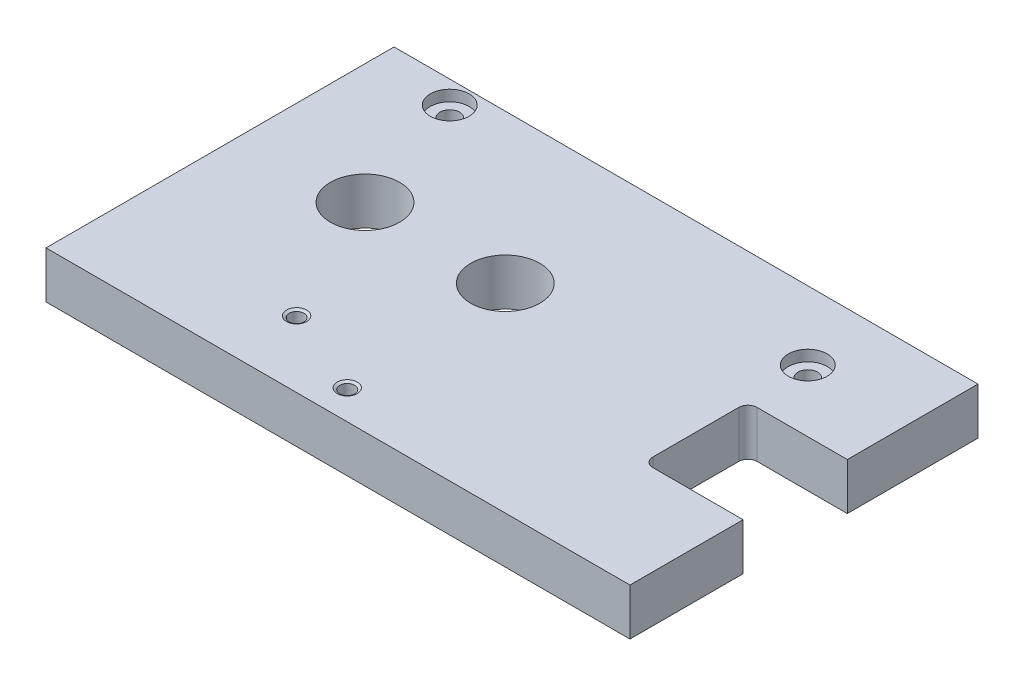
ISO-10303-21;
HEADER;
FILE_DESCRIPTION(('STEP AP214'),'2;1');
FILE_NAME('part.step','',(''),(''),'','','');
FILE_SCHEMA(('AUTOMOTIVE_DESIGN { 1 0 10303 214 1 1 1 1 }'));
ENDSEC;
DATA;
#1=APPLICATION_CONTEXT('core data for automotive mechanical design processes');
#2=APPLICATION_PROTOCOL_DEFINITION('international standard','automotive_design',2000,#1);
#3=PRODUCT_CONTEXT('',#1,'mechanical');
#4=PRODUCT('Part','Part','',(#3));
#5=PRODUCT_RELATED_PRODUCT_CATEGORY('part','',(#4));
#6=PRODUCT_DEFINITION_FORMATION('','',#4);
#7=PRODUCT_DEFINITION_CONTEXT('part definition',#1,'design');
#8=PRODUCT_DEFINITION('design','',#6,#7);
#9=PRODUCT_DEFINITION_SHAPE('','',#8);
#10=(LENGTH_UNIT() NAMED_UNIT(*) SI_UNIT(.MILLI.,.METRE.));
#11=(NAMED_UNIT(*) PLANE_ANGLE_UNIT() SI_UNIT($,.RADIAN.));
#12=(NAMED_UNIT(*) SI_UNIT($,.STERADIAN.) SOLID_ANGLE_UNIT());
#13=UNCERTAINTY_MEASURE_WITH_UNIT(LENGTH_MEASURE(1.E-05),#10,'distance_accuracy_value','');
#14=(GEOMETRIC_REPRESENTATION_CONTEXT(3) GLOBAL_UNCERTAINTY_ASSIGNED_CONTEXT((#13)) GLOBAL_UNIT_ASSIGNED_CONTEXT((#10,
#11,#12)) REPRESENTATION_CONTEXT('',''));
#15=CARTESIAN_POINT('',(0.,0.,0.));
#16=DIRECTION('',(0.,0.,1.));
#17=DIRECTION('',(1.,0.,0.));
#18=AXIS2_PLACEMENT_3D('',#15,#16,#17);
#19=CARTESIAN_POINT('',(21.425,12.83,6.17));
#20=DIRECTION('',(0.,1.,0.));
#21=DIRECTION('',(0.,0.,1.));
#22=AXIS2_PLACEMENT_3D('',#19,#20,#21);
#23=CYLINDRICAL_SURFACE('',#22,2.67500000000001);
#24=CARTESIAN_POINT('',(21.425,9.83,6.17));
#25=DIRECTION('',(0.,1.,0.));
#26=DIRECTION('',(0.,0.,1.));
#27=AXIS2_PLACEMENT_3D('',#24,#25,#26);
#28=CIRCLE('',#27,2.67500000000001);
#29=CARTESIAN_POINT('',(21.425,9.83,8.84500000000001));
#30=VERTEX_POINT('',#29);
#31=EDGE_CURVE('E206',#30,#30,#28,.T.);
#32=ORIENTED_EDGE('',*,*,#31,.T.);
#33=EDGE_LOOP('',(#32));
#34=FACE_BOUND('',#33,.T.);
#35=CARTESIAN_POINT('',(21.425,3.175,6.17));
#36=DIRECTION('',(0.,-1.,0.));
#37=DIRECTION('',(0.,0.,-1.));
#38=AXIS2_PLACEMENT_3D('',#35,#36,#37);
#39=CIRCLE('',#38,2.67500000000001);
#40=CARTESIAN_POINT('',(21.425,3.175,3.49499999999999));
#41=VERTEX_POINT('',#40);
#42=EDGE_CURVE('E36',#41,#41,#39,.F.);
#43=ORIENTED_EDGE('',*,*,#42,.F.);
#44=EDGE_LOOP('',(#43));
#45=FACE_BOUND('',#44,.T.);
#46=ADVANCED_FACE('F32',(#34,#45),#23,.F.);
#47=CARTESIAN_POINT('',(132.175,12.83,18.815));
#48=DIRECTION('',(0.,1.,0.));
#49=DIRECTION('',(0.,0.,1.));
#50=AXIS2_PLACEMENT_3D('',#47,#48,#49);
#51=CYLINDRICAL_SURFACE('',#50,2.67500000000001);
#52=CARTESIAN_POINT('',(132.175,9.83,18.815));
#53=DIRECTION('',(0.,1.,0.));
#54=DIRECTION('',(0.,0.,1.));
#55=AXIS2_PLACEMENT_3D('',#52,#53,#54);
#56=CIRCLE('',#55,2.67500000000001);
#57=CARTESIAN_POINT('',(132.175,9.83,21.49));
#58=VERTEX_POINT('',#57);
#59=EDGE_CURVE('E215',#58,#58,#56,.T.);
#60=ORIENTED_EDGE('',*,*,#59,.T.);
#61=EDGE_LOOP('',(#60));
#62=FACE_BOUND('',#61,.T.);
#63=CARTESIAN_POINT('',(132.175,3.301941,18.815));
#64=DIRECTION('',(0.,-1.,0.));
#65=DIRECTION('',(0.,0.,-1.));
#66=AXIS2_PLACEMENT_3D('',#63,#64,#65);
#67=CIRCLE('',#66,2.67500000000001);
#68=CARTESIAN_POINT('',(132.175,3.301941,16.14));
#69=VERTEX_POINT('',#68);
#70=EDGE_CURVE('E166',#69,#69,#67,.F.);
#71=ORIENTED_EDGE('',*,*,#70,.F.);
#72=EDGE_LOOP('',(#71));
#73=FACE_BOUND('',#72,.T.);
#74=ADVANCED_FACE('F277',(#62,#73),#51,.F.);
#75=CARTESIAN_POINT('',(160.,12.83,0.));
#76=DIRECTION('',(-1.,0.,0.));
#77=DIRECTION('',(0.,0.,1.));
#78=AXIS2_PLACEMENT_3D('',#75,#76,#77);
#79=PLANE('',#78);
#80=DIRECTION('',(0.,0.,-1.));
#81=VECTOR('',#80,1.);
#82=CARTESIAN_POINT('',(160.,0.,0.));
#83=LINE('',#82,#81);
#84=CARTESIAN_POINT('',(160.,0.,95.37));
#85=VERTEX_POINT('',#84);
#86=CARTESIAN_POINT('',(160.,0.,64.37));
#87=VERTEX_POINT('',#86);
#88=EDGE_CURVE('E131',#85,#87,#83,.T.);
#89=ORIENTED_EDGE('',*,*,#88,.T.);
#90=DIRECTION('',(0.,1.,0.));
#91=VECTOR('',#90,1.);
#92=CARTESIAN_POINT('',(160.,0.,64.37));
#93=LINE('',#92,#91);
#94=CARTESIAN_POINT('',(160.,12.83,64.37));
#95=VERTEX_POINT('',#94);
#96=EDGE_CURVE('E124',#87,#95,#93,.T.);
#97=ORIENTED_EDGE('',*,*,#96,.T.);
#98=DIRECTION('',(0.,0.,-1.));
#99=VECTOR('',#98,1.);
#100=CARTESIAN_POINT('',(160.,12.83,0.));
#101=LINE('',#100,#99);
#102=CARTESIAN_POINT('',(160.,12.83,95.37));
#103=VERTEX_POINT('',#102);
#104=EDGE_CURVE('E245',#103,#95,#101,.T.);
#105=ORIENTED_EDGE('',*,*,#104,.F.);
#106=DIRECTION('',(0.,-1.,0.));
#107=VECTOR('',#106,1.);
#108=CARTESIAN_POINT('',(160.,12.83,95.37));
#109=LINE('',#108,#107);
#110=EDGE_CURVE('E147',#103,#85,#109,.T.);
#111=ORIENTED_EDGE('',*,*,#110,.T.);
#112=EDGE_LOOP('',(#89,#97,#105,#111));
#113=FACE_BOUND('',#112,.T.);
#114=ADVANCED_FACE('F274',(#113),#79,.F.);
#115=CARTESIAN_POINT('',(0.,12.83,0.));
#116=DIRECTION('',(1.,0.,0.));
#117=DIRECTION('',(0.,0.,-1.));
#118=AXIS2_PLACEMENT_3D('',#115,#116,#117);
#119=PLANE('',#118);
#120=DIRECTION('',(0.,0.,1.));
#121=VECTOR('',#120,1.);
#122=CARTESIAN_POINT('',(0.,0.,0.));
#123=LINE('',#122,#121);
#124=CARTESIAN_POINT('',(0.,0.,0.));
#125=VERTEX_POINT('',#124);
#126=CARTESIAN_POINT('',(0.,0.,95.37));
#127=VERTEX_POINT('',#126);
#128=EDGE_CURVE('E135',#125,#127,#123,.T.);
#129=ORIENTED_EDGE('',*,*,#128,.T.);
#130=DIRECTION('',(0.,-1.,0.));
#131=VECTOR('',#130,1.);
#132=CARTESIAN_POINT('',(0.,12.83,95.37));
#133=LINE('',#132,#131);
#134=CARTESIAN_POINT('',(0.,12.83,95.37));
#135=VERTEX_POINT('',#134);
#136=EDGE_CURVE('E150',#135,#127,#133,.T.);
#137=ORIENTED_EDGE('',*,*,#136,.F.);
#138=DIRECTION('',(0.,0.,1.));
#139=VECTOR('',#138,1.);
#140=CARTESIAN_POINT('',(0.,12.83,0.));
#141=LINE('',#140,#139);
#142=CARTESIAN_POINT('',(0.,12.83,0.));
#143=VERTEX_POINT('',#142);
#144=EDGE_CURVE('E140',#143,#135,#141,.T.);
#145=ORIENTED_EDGE('',*,*,#144,.F.);
#146=DIRECTION('',(0.,-1.,0.));
#147=VECTOR('',#146,1.);
#148=CARTESIAN_POINT('',(0.,12.83,0.));
#149=LINE('',#148,#147);
#150=EDGE_CURVE('E141',#143,#125,#149,.T.);
#151=ORIENTED_EDGE('',*,*,#150,.T.);
#152=EDGE_LOOP('',(#129,#137,#145,#151));
#153=FACE_BOUND('',#152,.T.);
#154=ADVANCED_FACE('F251',(#153),#119,.F.);
#155=CARTESIAN_POINT('',(0.,12.83,95.37));
#156=DIRECTION('',(0.,0.,-1.));
#157=DIRECTION('',(-1.,0.,0.));
#158=AXIS2_PLACEMENT_3D('',#155,#156,#157);
#159=PLANE('',#158);
#160=DIRECTION('',(1.,0.,0.));
#161=VECTOR('',#160,1.);
#162=CARTESIAN_POINT('',(0.,0.,95.37));
#163=LINE('',#162,#161);
#164=EDGE_CURVE('E132',#127,#85,#163,.T.);
#165=ORIENTED_EDGE('',*,*,#164,.T.);
#166=ORIENTED_EDGE('',*,*,#110,.F.);
#167=DIRECTION('',(1.,0.,0.));
#168=VECTOR('',#167,1.);
#169=CARTESIAN_POINT('',(0.,12.83,95.37));
#170=LINE('',#169,#168);
#171=EDGE_CURVE('E243',#135,#103,#170,.T.);
#172=ORIENTED_EDGE('',*,*,#171,.F.);
#173=ORIENTED_EDGE('',*,*,#136,.T.);
#174=EDGE_LOOP('',(#165,#166,#172,#173));
#175=FACE_BOUND('',#174,.T.);
#176=ADVANCED_FACE('F257',(#175),#159,.F.);
#177=CARTESIAN_POINT('',(160.,12.83,35.81));
#178=VERTEX_POINT('',#177);
#179=CARTESIAN_POINT('',(160.,12.83,0.));
#180=VERTEX_POINT('',#179);
#181=EDGE_CURVE('E123',#178,#180,#101,.T.);
#182=ORIENTED_EDGE('',*,*,#181,.F.);
#183=DIRECTION('',(0.,1.,0.));
#184=VECTOR('',#183,1.);
#185=CARTESIAN_POINT('',(160.,0.,35.81));
#186=LINE('',#185,#184);
#187=CARTESIAN_POINT('',(160.,0.,35.81));
#188=VERTEX_POINT('',#187);
#189=EDGE_CURVE('E110',#188,#178,#186,.T.);
#190=ORIENTED_EDGE('',*,*,#189,.F.);
#191=CARTESIAN_POINT('',(160.,0.,0.));
#192=VERTEX_POINT('',#191);
#193=EDGE_CURVE('E121',#188,#192,#83,.T.);
#194=ORIENTED_EDGE('',*,*,#193,.T.);
#195=DIRECTION('',(0.,-1.,0.));
#196=VECTOR('',#195,1.);
#197=CARTESIAN_POINT('',(160.,12.83,0.));
#198=LINE('',#197,#196);
#199=EDGE_CURVE('E144',#180,#192,#198,.T.);
#200=ORIENTED_EDGE('',*,*,#199,.F.);
#201=EDGE_LOOP('',(#182,#190,#194,#200));
#202=FACE_BOUND('',#201,.T.);
#203=ADVANCED_FACE('F119',(#202),#79,.F.);
#204=CARTESIAN_POINT('',(0.,12.83,0.));
#205=DIRECTION('',(0.,0.,1.));
#206=DIRECTION('',(1.,0.,0.));
#207=AXIS2_PLACEMENT_3D('',#204,#205,#206);
#208=PLANE('',#207);
#209=DIRECTION('',(-1.,0.,0.));
#210=VECTOR('',#209,1.);
#211=CARTESIAN_POINT('',(0.,0.,0.));
#212=LINE('',#211,#210);
#213=EDGE_CURVE('E130',#192,#125,#212,.T.);
#214=ORIENTED_EDGE('',*,*,#213,.T.);
#215=ORIENTED_EDGE('',*,*,#150,.F.);
#216=DIRECTION('',(-1.,0.,0.));
#217=VECTOR('',#216,1.);
#218=CARTESIAN_POINT('',(0.,12.83,0.));
#219=LINE('',#218,#217);
#220=EDGE_CURVE('E145',#180,#143,#219,.T.);
#221=ORIENTED_EDGE('',*,*,#220,.F.);
#222=ORIENTED_EDGE('',*,*,#199,.T.);
#223=EDGE_LOOP('',(#214,#215,#221,#222));
#224=FACE_BOUND('',#223,.T.);
#225=ADVANCED_FACE('F264',(#224),#208,.F.);
#226=CARTESIAN_POINT('',(0.,12.83,95.37));
#227=DIRECTION('',(0.,1.,0.));
#228=DIRECTION('',(0.,0.,1.));
#229=AXIS2_PLACEMENT_3D('',#226,#227,#228);
#230=PLANE('',#229);
#231=CARTESIAN_POINT('',(50.46,12.83,77.16));
#232=DIRECTION('',(0.,1.,0.));
#233=DIRECTION('',(0.,0.,1.));
#234=AXIS2_PLACEMENT_3D('',#231,#232,#233);
#235=CIRCLE('',#234,2.75);
#236=CARTESIAN_POINT('',(50.46,12.83,79.91));
#237=VERTEX_POINT('',#236);
#238=EDGE_CURVE('E168',#237,#237,#235,.T.);
#239=ORIENTED_EDGE('',*,*,#238,.F.);
#240=EDGE_LOOP('',(#239));
#241=FACE_BOUND('',#240,.T.);
#242=CARTESIAN_POINT('',(74.48,12.83,87.31));
#243=DIRECTION('',(0.,1.,0.));
#244=DIRECTION('',(0.,0.,1.));
#245=AXIS2_PLACEMENT_3D('',#242,#243,#244);
#246=CIRCLE('',#245,2.75);
#247=CARTESIAN_POINT('',(74.48,12.83,90.06));
#248=VERTEX_POINT('',#247);
#249=EDGE_CURVE('E191',#248,#248,#246,.T.);
#250=ORIENTED_EDGE('',*,*,#249,.F.);
#251=EDGE_LOOP('',(#250));
#252=FACE_BOUND('',#251,.T.);
#253=CARTESIAN_POINT('',(21.425,12.83,6.17));
#254=DIRECTION('',(0.,1.,0.));
#255=DIRECTION('',(0.,0.,1.));
#256=AXIS2_PLACEMENT_3D('',#253,#254,#255);
#257=CIRCLE('',#256,5.32500000000001);
#258=CARTESIAN_POINT('',(21.425,12.83,11.495));
#259=VERTEX_POINT('',#258);
#260=EDGE_CURVE('E200',#259,#259,#257,.T.);
#261=ORIENTED_EDGE('',*,*,#260,.F.);
#262=EDGE_LOOP('',(#261));
#263=FACE_BOUND('',#262,.T.);
#264=CARTESIAN_POINT('',(132.175,12.83,18.815));
#265=DIRECTION('',(0.,1.,0.));
#266=DIRECTION('',(0.,0.,1.));
#267=AXIS2_PLACEMENT_3D('',#264,#265,#266);
#268=CIRCLE('',#267,5.32500000000002);
#269=CARTESIAN_POINT('',(132.175,12.83,24.14));
#270=VERTEX_POINT('',#269);
#271=EDGE_CURVE('E209',#270,#270,#268,.T.);
#272=ORIENTED_EDGE('',*,*,#271,.F.);
#273=EDGE_LOOP('',(#272));
#274=FACE_BOUND('',#273,.T.);
#275=DIRECTION('',(1.,0.,0.));
#276=VECTOR('',#275,1.);
#277=CARTESIAN_POINT('',(160.,12.83,64.37));
#278=LINE('',#277,#276);
#279=CARTESIAN_POINT('',(135.26,12.83,64.37));
#280=VERTEX_POINT('',#279);
#281=EDGE_CURVE('E115',#280,#95,#278,.T.);
#282=ORIENTED_EDGE('',*,*,#281,.F.);
#283=CARTESIAN_POINT('',(135.26,12.83,61.87));
#284=DIRECTION('',(0.,1.,0.));
#285=DIRECTION('',(0.,0.,1.));
#286=AXIS2_PLACEMENT_3D('',#283,#284,#285);
#287=CIRCLE('',#286,2.5);
#288=CARTESIAN_POINT('',(132.76,12.83,61.87));
#289=VERTEX_POINT('',#288);
#290=EDGE_CURVE('E162',#280,#289,#287,.F.);
#291=ORIENTED_EDGE('',*,*,#290,.T.);
#292=DIRECTION('',(0.,0.,1.));
#293=VECTOR('',#292,1.);
#294=CARTESIAN_POINT('',(132.76,12.83,64.37));
#295=LINE('',#294,#293);
#296=CARTESIAN_POINT('',(132.76,12.83,38.31));
#297=VERTEX_POINT('',#296);
#298=EDGE_CURVE('E223',#297,#289,#295,.T.);
#299=ORIENTED_EDGE('',*,*,#298,.F.);
#300=CARTESIAN_POINT('',(135.26,12.83,38.31));
#301=DIRECTION('',(0.,1.,0.));
#302=DIRECTION('',(0.,0.,1.));
#303=AXIS2_PLACEMENT_3D('',#300,#301,#302);
#304=CIRCLE('',#303,2.5);
#305=CARTESIAN_POINT('',(135.26,12.83,35.81));
#306=VERTEX_POINT('',#305);
#307=EDGE_CURVE('E41',#297,#306,#304,.F.);
#308=ORIENTED_EDGE('',*,*,#307,.T.);
#309=DIRECTION('',(-1.,0.,0.));
#310=VECTOR('',#309,1.);
#311=CARTESIAN_POINT('',(160.,12.83,35.81));
#312=LINE('',#311,#310);
#313=EDGE_CURVE('E217',#178,#306,#312,.T.);
#314=ORIENTED_EDGE('',*,*,#313,.F.);
#315=ORIENTED_EDGE('',*,*,#181,.T.);
#316=ORIENTED_EDGE('',*,*,#220,.T.);
#317=ORIENTED_EDGE('',*,*,#144,.T.);
#318=ORIENTED_EDGE('',*,*,#171,.T.);
#319=ORIENTED_EDGE('',*,*,#104,.T.);
#320=EDGE_LOOP('',(#282,#291,#299,#308,#314,#315,#316,#317,#318,#319));
#321=FACE_BOUND('',#320,.T.);
#322=CARTESIAN_POINT('',(32.885,12.83,40.845));
#323=DIRECTION('',(0.,1.,0.));
#324=DIRECTION('',(0.,0.,1.));
#325=AXIS2_PLACEMENT_3D('',#322,#323,#324);
#326=CIRCLE('',#325,9.48500000000001);
#327=CARTESIAN_POINT('',(32.885,12.83,50.33));
#328=VERTEX_POINT('',#327);
#329=EDGE_CURVE('E228',#328,#328,#326,.T.);
#330=ORIENTED_EDGE('',*,*,#329,.F.);
#331=EDGE_LOOP('',(#330));
#332=FACE_BOUND('',#331,.T.);
#333=CARTESIAN_POINT('',(71.315,12.83,40.845));
#334=DIRECTION('',(0.,1.,0.));
#335=DIRECTION('',(0.,0.,1.));
#336=AXIS2_PLACEMENT_3D('',#333,#334,#335);
#337=CIRCLE('',#336,9.48500000000002);
#338=CARTESIAN_POINT('',(71.315,12.83,50.33));
#339=VERTEX_POINT('',#338);
#340=EDGE_CURVE('E235',#339,#339,#337,.T.);
#341=ORIENTED_EDGE('',*,*,#340,.F.);
#342=EDGE_LOOP('',(#341));
#343=FACE_BOUND('',#342,.T.);
#344=ADVANCED_FACE('F260',(#241,#252,#263,#274,#321,#332,#343),#230,.T.);
#345=CARTESIAN_POINT('',(0.,0.,95.37));
#346=DIRECTION('',(0.,1.,0.));
#347=DIRECTION('',(0.,0.,1.));
#348=AXIS2_PLACEMENT_3D('',#345,#346,#347);
#349=PLANE('',#348);
#350=CARTESIAN_POINT('',(21.425,0.,6.17));
#351=DIRECTION('',(0.,-1.,0.));
#352=DIRECTION('',(0.,0.,-1.));
#353=AXIS2_PLACEMENT_3D('',#350,#351,#352);
#354=CIRCLE('',#353,5.08);
#355=CARTESIAN_POINT('',(21.425,0.,1.09));
#356=VERTEX_POINT('',#355);
#357=EDGE_CURVE('E183',#356,#356,#354,.T.);
#358=ORIENTED_EDGE('',*,*,#357,.F.);
#359=EDGE_LOOP('',(#358));
#360=FACE_BOUND('',#359,.T.);
#361=CARTESIAN_POINT('',(132.175,0.,18.815));
#362=DIRECTION('',(0.,-1.,0.));
#363=DIRECTION('',(0.,0.,-1.));
#364=AXIS2_PLACEMENT_3D('',#361,#362,#363);
#365=CIRCLE('',#364,9.525);
#366=CARTESIAN_POINT('',(132.175,0.,9.29));
#367=VERTEX_POINT('',#366);
#368=EDGE_CURVE('E176',#367,#367,#365,.T.);
#369=ORIENTED_EDGE('',*,*,#368,.F.);
#370=EDGE_LOOP('',(#369));
#371=FACE_BOUND('',#370,.T.);
#372=CARTESIAN_POINT('',(50.46,0.,77.16));
#373=DIRECTION('',(0.,1.,0.));
#374=DIRECTION('',(0.,0.,1.));
#375=AXIS2_PLACEMENT_3D('',#372,#373,#374);
#376=CIRCLE('',#375,2.04);
#377=CARTESIAN_POINT('',(50.46,0.,79.2));
#378=VERTEX_POINT('',#377);
#379=EDGE_CURVE('E188',#378,#378,#376,.T.);
#380=ORIENTED_EDGE('',*,*,#379,.T.);
#381=EDGE_LOOP('',(#380));
#382=FACE_BOUND('',#381,.T.);
#383=CARTESIAN_POINT('',(74.48,0.,87.31));
#384=DIRECTION('',(0.,1.,0.));
#385=DIRECTION('',(0.,0.,1.));
#386=AXIS2_PLACEMENT_3D('',#383,#384,#385);
#387=CIRCLE('',#386,2.04);
#388=CARTESIAN_POINT('',(74.48,0.,89.35));
#389=VERTEX_POINT('',#388);
#390=EDGE_CURVE('E197',#389,#389,#387,.T.);
#391=ORIENTED_EDGE('',*,*,#390,.T.);
#392=EDGE_LOOP('',(#391));
#393=FACE_BOUND('',#392,.T.);
#394=CARTESIAN_POINT('',(32.885,0.,40.845));
#395=DIRECTION('',(0.,1.,0.));
#396=DIRECTION('',(0.,0.,1.));
#397=AXIS2_PLACEMENT_3D('',#394,#395,#396);
#398=CIRCLE('',#397,9.48500000000001);
#399=CARTESIAN_POINT('',(32.885,0.,50.33));
#400=VERTEX_POINT('',#399);
#401=EDGE_CURVE('E232',#400,#400,#398,.T.);
#402=ORIENTED_EDGE('',*,*,#401,.T.);
#403=EDGE_LOOP('',(#402));
#404=FACE_BOUND('',#403,.T.);
#405=CARTESIAN_POINT('',(71.315,0.,40.845));
#406=DIRECTION('',(0.,1.,0.));
#407=DIRECTION('',(0.,0.,1.));
#408=AXIS2_PLACEMENT_3D('',#405,#406,#407);
#409=CIRCLE('',#408,9.48500000000001);
#410=CARTESIAN_POINT('',(71.315,0.,50.33));
#411=VERTEX_POINT('',#410);
#412=EDGE_CURVE('E238',#411,#411,#409,.T.);
#413=ORIENTED_EDGE('',*,*,#412,.T.);
#414=EDGE_LOOP('',(#413));
#415=FACE_BOUND('',#414,.T.);
#416=DIRECTION('',(-1.,0.,0.));
#417=VECTOR('',#416,1.);
#418=CARTESIAN_POINT('',(160.,0.,35.81));
#419=LINE('',#418,#417);
#420=CARTESIAN_POINT('',(135.26,0.,35.81));
#421=VERTEX_POINT('',#420);
#422=EDGE_CURVE('E107',#188,#421,#419,.T.);
#423=ORIENTED_EDGE('',*,*,#422,.T.);
#424=CARTESIAN_POINT('',(135.26,0.,38.31));
#425=DIRECTION('',(0.,1.,0.));
#426=DIRECTION('',(0.,0.,1.));
#427=AXIS2_PLACEMENT_3D('',#424,#425,#426);
#428=CIRCLE('',#427,2.5);
#429=CARTESIAN_POINT('',(132.76,0.,38.31));
#430=VERTEX_POINT('',#429);
#431=EDGE_CURVE('E11',#421,#430,#428,.T.);
#432=ORIENTED_EDGE('',*,*,#431,.T.);
#433=DIRECTION('',(0.,0.,1.));
#434=VECTOR('',#433,1.);
#435=CARTESIAN_POINT('',(132.76,0.,64.37));
#436=LINE('',#435,#434);
#437=CARTESIAN_POINT('',(132.76,0.,61.87));
#438=VERTEX_POINT('',#437);
#439=EDGE_CURVE('E114',#430,#438,#436,.T.);
#440=ORIENTED_EDGE('',*,*,#439,.T.);
#441=CARTESIAN_POINT('',(135.26,0.,61.87));
#442=DIRECTION('',(0.,1.,0.));
#443=DIRECTION('',(0.,0.,1.));
#444=AXIS2_PLACEMENT_3D('',#441,#442,#443);
#445=CIRCLE('',#444,2.5);
#446=CARTESIAN_POINT('',(135.26,0.,64.37));
#447=VERTEX_POINT('',#446);
#448=EDGE_CURVE('E164',#438,#447,#445,.T.);
#449=ORIENTED_EDGE('',*,*,#448,.T.);
#450=DIRECTION('',(1.,0.,0.));
#451=VECTOR('',#450,1.);
#452=CARTESIAN_POINT('',(160.,0.,64.37));
#453=LINE('',#452,#451);
#454=EDGE_CURVE('E125',#447,#87,#453,.T.);
#455=ORIENTED_EDGE('',*,*,#454,.T.);
#456=ORIENTED_EDGE('',*,*,#88,.F.);
#457=ORIENTED_EDGE('',*,*,#164,.F.);
#458=ORIENTED_EDGE('',*,*,#128,.F.);
#459=ORIENTED_EDGE('',*,*,#213,.F.);
#460=ORIENTED_EDGE('',*,*,#193,.F.);
#461=EDGE_LOOP('',(#423,#432,#440,#449,#455,#456,#457,#458,#459,#460));
#462=FACE_BOUND('',#461,.T.);
#463=ADVANCED_FACE('F128',(#360,#371,#382,#393,#404,#415,#462),#349,.F.);
#464=CARTESIAN_POINT('',(71.315,12.83,40.845));
#465=DIRECTION('',(0.,1.,0.));
#466=DIRECTION('',(0.,0.,1.));
#467=AXIS2_PLACEMENT_3D('',#464,#465,#466);
#468=CYLINDRICAL_SURFACE('',#467,9.48500000000001);
#469=ORIENTED_EDGE('',*,*,#412,.F.);
#470=EDGE_LOOP('',(#469));
#471=FACE_BOUND('',#470,.T.);
#472=ORIENTED_EDGE('',*,*,#340,.T.);
#473=EDGE_LOOP('',(#472));
#474=FACE_BOUND('',#473,.T.);
#475=ADVANCED_FACE('F312',(#471,#474),#468,.F.);
#476=CARTESIAN_POINT('',(32.885,12.83,40.845));
#477=DIRECTION('',(0.,1.,0.));
#478=DIRECTION('',(0.,0.,1.));
#479=AXIS2_PLACEMENT_3D('',#476,#477,#478);
#480=CYLINDRICAL_SURFACE('',#479,9.48500000000001);
#481=ORIENTED_EDGE('',*,*,#401,.F.);
#482=EDGE_LOOP('',(#481));
#483=FACE_BOUND('',#482,.T.);
#484=ORIENTED_EDGE('',*,*,#329,.T.);
#485=EDGE_LOOP('',(#484));
#486=FACE_BOUND('',#485,.T.);
#487=ADVANCED_FACE('F302',(#483,#486),#480,.F.);
#488=CARTESIAN_POINT('',(160.,0.,64.37));
#489=DIRECTION('',(0.,0.,1.));
#490=DIRECTION('',(1.,0.,0.));
#491=AXIS2_PLACEMENT_3D('',#488,#489,#490);
#492=PLANE('',#491);
#493=ORIENTED_EDGE('',*,*,#454,.F.);
#494=DIRECTION('',(0.,1.,0.));
#495=VECTOR('',#494,1.);
#496=CARTESIAN_POINT('',(135.26,12.83,64.37));
#497=LINE('',#496,#495);
#498=EDGE_CURVE('E153',#447,#280,#497,.T.);
#499=ORIENTED_EDGE('',*,*,#498,.T.);
#500=ORIENTED_EDGE('',*,*,#281,.T.);
#501=ORIENTED_EDGE('',*,*,#96,.F.);
#502=EDGE_LOOP('',(#493,#499,#500,#501));
#503=FACE_BOUND('',#502,.T.);
#504=ADVANCED_FACE('F298',(#503),#492,.F.);
#505=CARTESIAN_POINT('',(132.76,0.,64.37));
#506=DIRECTION('',(-1.,0.,0.));
#507=DIRECTION('',(0.,0.,1.));
#508=AXIS2_PLACEMENT_3D('',#505,#506,#507);
#509=PLANE('',#508);
#510=ORIENTED_EDGE('',*,*,#298,.T.);
#511=DIRECTION('',(0.,1.,0.));
#512=VECTOR('',#511,1.);
#513=CARTESIAN_POINT('',(132.76,0.,61.87));
#514=LINE('',#513,#512);
#515=EDGE_CURVE('E159',#289,#438,#514,.F.);
#516=ORIENTED_EDGE('',*,*,#515,.T.);
#517=ORIENTED_EDGE('',*,*,#439,.F.);
#518=DIRECTION('',(0.,1.,0.));
#519=VECTOR('',#518,1.);
#520=CARTESIAN_POINT('',(132.76,12.83,38.31));
#521=LINE('',#520,#519);
#522=EDGE_CURVE('E156',#430,#297,#521,.T.);
#523=ORIENTED_EDGE('',*,*,#522,.T.);
#524=EDGE_LOOP('',(#510,#516,#517,#523));
#525=FACE_BOUND('',#524,.T.);
#526=ADVANCED_FACE('F301',(#525),#509,.F.);
#527=CARTESIAN_POINT('',(160.,0.,35.81));
#528=DIRECTION('',(0.,0.,-1.));
#529=DIRECTION('',(-1.,0.,0.));
#530=AXIS2_PLACEMENT_3D('',#527,#528,#529);
#531=PLANE('',#530);
#532=ORIENTED_EDGE('',*,*,#313,.T.);
#533=DIRECTION('',(0.,1.,0.));
#534=VECTOR('',#533,1.);
#535=CARTESIAN_POINT('',(135.26,0.,35.81));
#536=LINE('',#535,#534);
#537=EDGE_CURVE('E49',#306,#421,#536,.F.);
#538=ORIENTED_EDGE('',*,*,#537,.T.);
#539=ORIENTED_EDGE('',*,*,#422,.F.);
#540=ORIENTED_EDGE('',*,*,#189,.T.);
#541=EDGE_LOOP('',(#532,#538,#539,#540));
#542=FACE_BOUND('',#541,.T.);
#543=ADVANCED_FACE('F109',(#542),#531,.F.);
#544=CARTESIAN_POINT('',(135.26,0.,61.87));
#545=DIRECTION('',(0.,-1.,0.));
#546=DIRECTION('',(0.,0.,-1.));
#547=AXIS2_PLACEMENT_3D('',#544,#545,#546);
#548=CYLINDRICAL_SURFACE('',#547,2.5);
#549=ORIENTED_EDGE('',*,*,#448,.F.);
#550=ORIENTED_EDGE('',*,*,#515,.F.);
#551=ORIENTED_EDGE('',*,*,#290,.F.);
#552=ORIENTED_EDGE('',*,*,#498,.F.);
#553=EDGE_LOOP('',(#549,#550,#551,#552));
#554=FACE_BOUND('',#553,.T.);
#555=ADVANCED_FACE('F309',(#554),#548,.F.);
#556=CARTESIAN_POINT('',(135.26,0.,38.31));
#557=DIRECTION('',(0.,-1.,0.));
#558=DIRECTION('',(0.,0.,-1.));
#559=AXIS2_PLACEMENT_3D('',#556,#557,#558);
#560=CYLINDRICAL_SURFACE('',#559,2.5);
#561=ORIENTED_EDGE('',*,*,#431,.F.);
#562=ORIENTED_EDGE('',*,*,#537,.F.);
#563=ORIENTED_EDGE('',*,*,#307,.F.);
#564=ORIENTED_EDGE('',*,*,#522,.F.);
#565=EDGE_LOOP('',(#561,#562,#563,#564));
#566=FACE_BOUND('',#565,.T.);
#567=ADVANCED_FACE('F34',(#566),#560,.F.);
#568=CARTESIAN_POINT('',(134.85,9.83,18.815));
#569=DIRECTION('',(0.,-1.,0.));
#570=DIRECTION('',(0.,0.,-1.));
#571=AXIS2_PLACEMENT_3D('',#568,#569,#570);
#572=PLANE('',#571);
#573=ORIENTED_EDGE('',*,*,#59,.F.);
#574=EDGE_LOOP('',(#573));
#575=FACE_BOUND('',#574,.T.);
#576=CARTESIAN_POINT('',(132.175,9.83,18.815));
#577=DIRECTION('',(0.,1.,0.));
#578=DIRECTION('',(0.,0.,1.));
#579=AXIS2_PLACEMENT_3D('',#576,#577,#578);
#580=CIRCLE('',#579,5.32500000000002);
#581=CARTESIAN_POINT('',(132.175,9.83,24.14));
#582=VERTEX_POINT('',#581);
#583=EDGE_CURVE('E212',#582,#582,#580,.T.);
#584=ORIENTED_EDGE('',*,*,#583,.T.);
#585=EDGE_LOOP('',(#584));
#586=FACE_BOUND('',#585,.T.);
#587=ADVANCED_FACE('F293',(#575,#586),#572,.F.);
#588=CARTESIAN_POINT('',(132.175,12.83,18.815));
#589=DIRECTION('',(0.,1.,0.));
#590=DIRECTION('',(0.,0.,1.));
#591=AXIS2_PLACEMENT_3D('',#588,#589,#590);
#592=CYLINDRICAL_SURFACE('',#591,5.32500000000002);
#593=ORIENTED_EDGE('',*,*,#583,.F.);
#594=EDGE_LOOP('',(#593));
#595=FACE_BOUND('',#594,.T.);
#596=ORIENTED_EDGE('',*,*,#271,.T.);
#597=EDGE_LOOP('',(#596));
#598=FACE_BOUND('',#597,.T.);
#599=ADVANCED_FACE('F290',(#595,#598),#592,.F.);
#600=CARTESIAN_POINT('',(24.1,9.83,6.17));
#601=DIRECTION('',(0.,-1.,0.));
#602=DIRECTION('',(0.,0.,-1.));
#603=AXIS2_PLACEMENT_3D('',#600,#601,#602);
#604=PLANE('',#603);
#605=ORIENTED_EDGE('',*,*,#31,.F.);
#606=EDGE_LOOP('',(#605));
#607=FACE_BOUND('',#606,.T.);
#608=CARTESIAN_POINT('',(21.425,9.83,6.17));
#609=DIRECTION('',(0.,1.,0.));
#610=DIRECTION('',(0.,0.,1.));
#611=AXIS2_PLACEMENT_3D('',#608,#609,#610);
#612=CIRCLE('',#611,5.32500000000001);
#613=CARTESIAN_POINT('',(21.425,9.83,11.495));
#614=VERTEX_POINT('',#613);
#615=EDGE_CURVE('E203',#614,#614,#612,.T.);
#616=ORIENTED_EDGE('',*,*,#615,.T.);
#617=EDGE_LOOP('',(#616));
#618=FACE_BOUND('',#617,.T.);
#619=ADVANCED_FACE('F288',(#607,#618),#604,.F.);
#620=CARTESIAN_POINT('',(21.425,12.83,6.17));
#621=DIRECTION('',(0.,1.,0.));
#622=DIRECTION('',(0.,0.,1.));
#623=AXIS2_PLACEMENT_3D('',#620,#621,#622);
#624=CYLINDRICAL_SURFACE('',#623,5.32500000000001);
#625=ORIENTED_EDGE('',*,*,#615,.F.);
#626=EDGE_LOOP('',(#625));
#627=FACE_BOUND('',#626,.T.);
#628=ORIENTED_EDGE('',*,*,#260,.T.);
#629=EDGE_LOOP('',(#628));
#630=FACE_BOUND('',#629,.T.);
#631=ADVANCED_FACE('F342',(#627,#630),#624,.F.);
#632=CARTESIAN_POINT('',(74.48,12.83,87.31));
#633=DIRECTION('',(0.,1.,0.));
#634=DIRECTION('',(0.,0.,1.));
#635=AXIS2_PLACEMENT_3D('',#632,#633,#634);
#636=CYLINDRICAL_SURFACE('',#635,2.04);
#637=ORIENTED_EDGE('',*,*,#390,.F.);
#638=EDGE_LOOP('',(#637));
#639=FACE_BOUND('',#638,.T.);
#640=CARTESIAN_POINT('',(74.48,12.4200813088754,87.31));
#641=DIRECTION('',(0.,1.,0.));
#642=DIRECTION('',(0.,0.,1.));
#643=AXIS2_PLACEMENT_3D('',#640,#641,#642);
#644=CIRCLE('',#643,2.04);
#645=CARTESIAN_POINT('',(74.48,12.4200813088754,89.35));
#646=VERTEX_POINT('',#645);
#647=EDGE_CURVE('E194',#646,#646,#644,.T.);
#648=ORIENTED_EDGE('',*,*,#647,.T.);
#649=EDGE_LOOP('',(#648));
#650=FACE_BOUND('',#649,.T.);
#651=ADVANCED_FACE('F338',(#639,#650),#636,.F.);
#652=CARTESIAN_POINT('',(74.48,12.83,87.31));
#653=DIRECTION('',(0.,1.,0.));
#654=DIRECTION('',(0.,0.,1.));
#655=AXIS2_PLACEMENT_3D('',#652,#653,#654);
#656=CONICAL_SURFACE('',#655,2.75,1.04719755119661);
#657=ORIENTED_EDGE('',*,*,#647,.F.);
#658=EDGE_LOOP('',(#657));
#659=FACE_BOUND('',#658,.T.);
#660=ORIENTED_EDGE('',*,*,#249,.T.);
#661=EDGE_LOOP('',(#660));
#662=FACE_BOUND('',#661,.T.);
#663=ADVANCED_FACE('F341',(#659,#662),#656,.F.);
#664=CARTESIAN_POINT('',(50.46,12.83,77.16));
#665=DIRECTION('',(0.,1.,0.));
#666=DIRECTION('',(0.,0.,1.));
#667=AXIS2_PLACEMENT_3D('',#664,#665,#666);
#668=CYLINDRICAL_SURFACE('',#667,2.04);
#669=ORIENTED_EDGE('',*,*,#379,.F.);
#670=EDGE_LOOP('',(#669));
#671=FACE_BOUND('',#670,.T.);
#672=CARTESIAN_POINT('',(50.46,12.4200813088754,77.16));
#673=DIRECTION('',(0.,1.,0.));
#674=DIRECTION('',(0.,0.,1.));
#675=AXIS2_PLACEMENT_3D('',#672,#673,#674);
#676=CIRCLE('',#675,2.04);
#677=CARTESIAN_POINT('',(50.46,12.4200813088754,79.2));
#678=VERTEX_POINT('',#677);
#679=EDGE_CURVE('E173',#678,#678,#676,.T.);
#680=ORIENTED_EDGE('',*,*,#679,.T.);
#681=EDGE_LOOP('',(#680));
#682=FACE_BOUND('',#681,.T.);
#683=ADVANCED_FACE('F348',(#671,#682),#668,.F.);
#684=CARTESIAN_POINT('',(50.46,12.83,77.16));
#685=DIRECTION('',(0.,1.,0.));
#686=DIRECTION('',(0.,0.,1.));
#687=AXIS2_PLACEMENT_3D('',#684,#685,#686);
#688=CONICAL_SURFACE('',#687,2.75,1.04719755119661);
#689=ORIENTED_EDGE('',*,*,#679,.F.);
#690=EDGE_LOOP('',(#689));
#691=FACE_BOUND('',#690,.T.);
#692=ORIENTED_EDGE('',*,*,#238,.T.);
#693=EDGE_LOOP('',(#692));
#694=FACE_BOUND('',#693,.T.);
#695=ADVANCED_FACE('F368',(#691,#694),#688,.F.);
#696=CARTESIAN_POINT('',(132.175,3.301941,18.815));
#697=DIRECTION('',(0.,-1.,0.));
#698=DIRECTION('',(0.,0.,-1.));
#699=AXIS2_PLACEMENT_3D('',#696,#697,#698);
#700=PLANE('',#699);
#701=CARTESIAN_POINT('',(132.175,3.301941,18.815));
#702=DIRECTION('',(0.,-1.,0.));
#703=DIRECTION('',(0.,0.,-1.));
#704=AXIS2_PLACEMENT_3D('',#701,#702,#703);
#705=CIRCLE('',#704,9.525);
#706=CARTESIAN_POINT('',(132.175,3.301941,9.29));
#707=VERTEX_POINT('',#706);
#708=EDGE_CURVE('E169',#707,#707,#705,.T.);
#709=ORIENTED_EDGE('',*,*,#708,.T.);
#710=EDGE_LOOP('',(#709));
#711=FACE_BOUND('',#710,.T.);
#712=ORIENTED_EDGE('',*,*,#70,.T.);
#713=EDGE_LOOP('',(#712));
#714=FACE_BOUND('',#713,.T.);
#715=ADVANCED_FACE('F372',(#711,#714),#700,.T.);
#716=CARTESIAN_POINT('',(132.175,3.301941,18.815));
#717=DIRECTION('',(0.,-1.,0.));
#718=DIRECTION('',(0.,0.,-1.));
#719=AXIS2_PLACEMENT_3D('',#716,#717,#718);
#720=CYLINDRICAL_SURFACE('',#719,9.525);
#721=CARTESIAN_POINT('',(132.175,3.301941,9.29));
#722=CARTESIAN_POINT('',(132.175,3.26754578125,9.29));
#723=CARTESIAN_POINT('',(132.175,3.2331505625,9.29));
#724=CARTESIAN_POINT('',(132.175,3.164360125,9.29));
#725=CARTESIAN_POINT('',(132.175,3.12996490625,9.29));
#726=CARTESIAN_POINT('',(132.175,3.06117446875,9.29));
#727=CARTESIAN_POINT('',(132.175,3.02677925,9.29));
#728=CARTESIAN_POINT('',(132.175,2.9579888125,9.29));
#729=CARTESIAN_POINT('',(132.175,2.92359359375,9.29));
#730=CARTESIAN_POINT('',(132.175,2.85480315625,9.29));
#731=CARTESIAN_POINT('',(132.175,2.8204079375,9.29));
#732=CARTESIAN_POINT('',(132.175,2.7516175,9.29));
#733=CARTESIAN_POINT('',(132.175,2.71722228125,9.29));
#734=CARTESIAN_POINT('',(132.175,2.64843184375,9.29));
#735=CARTESIAN_POINT('',(132.175,2.614036625,9.29));
#736=CARTESIAN_POINT('',(132.175,2.5452461875,9.29));
#737=CARTESIAN_POINT('',(132.175,2.51085096875,9.29));
#738=CARTESIAN_POINT('',(132.175,2.44206053125,9.29));
#739=CARTESIAN_POINT('',(132.175,2.4076653125,9.29));
#740=CARTESIAN_POINT('',(132.175,2.338874875,9.29));
#741=CARTESIAN_POINT('',(132.175,2.30447965625,9.29));
#742=CARTESIAN_POINT('',(132.175,2.23568921875,9.29));
#743=CARTESIAN_POINT('',(132.175,2.201294,9.29));
#744=CARTESIAN_POINT('',(132.175,2.1325035625,9.29));
#745=CARTESIAN_POINT('',(132.175,2.09810834375,9.29));
#746=CARTESIAN_POINT('',(132.175,2.02931790625,9.29));
#747=CARTESIAN_POINT('',(132.175,1.9949226875,9.29));
#748=CARTESIAN_POINT('',(132.175,1.92613225,9.29));
#749=CARTESIAN_POINT('',(132.175,1.89173703125,9.29));
#750=CARTESIAN_POINT('',(132.175,1.82294659375,9.29));
#751=CARTESIAN_POINT('',(132.175,1.788551375,9.29));
#752=CARTESIAN_POINT('',(132.175,1.7197609375,9.29));
#753=CARTESIAN_POINT('',(132.175,1.68536571875,9.29));
#754=CARTESIAN_POINT('',(132.175,1.61657528125,9.29));
#755=CARTESIAN_POINT('',(132.175,1.5821800625,9.29));
#756=CARTESIAN_POINT('',(132.175,1.513389625,9.29));
#757=CARTESIAN_POINT('',(132.175,1.47899440625,9.29));
#758=CARTESIAN_POINT('',(132.175,1.41020396875,9.29));
#759=CARTESIAN_POINT('',(132.175,1.37580875,9.29));
#760=CARTESIAN_POINT('',(132.175,1.3070183125,9.29));
#761=CARTESIAN_POINT('',(132.175,1.27262309375,9.29));
#762=CARTESIAN_POINT('',(132.175,1.20383265625,9.29));
#763=CARTESIAN_POINT('',(132.175,1.1694374375,9.29));
#764=CARTESIAN_POINT('',(132.175,1.100647,9.29));
#765=CARTESIAN_POINT('',(132.175,1.06625178125,9.29));
#766=CARTESIAN_POINT('',(132.175,0.997461343750001,9.29));
#767=CARTESIAN_POINT('',(132.175,0.963066125000001,9.29));
#768=CARTESIAN_POINT('',(132.175,0.894275687500001,9.29));
#769=CARTESIAN_POINT('',(132.175,0.859880468750001,9.29));
#770=CARTESIAN_POINT('',(132.175,0.791090031250001,9.29));
#771=CARTESIAN_POINT('',(132.175,0.756694812500001,9.29));
#772=CARTESIAN_POINT('',(132.175,0.687904375000001,9.29));
#773=CARTESIAN_POINT('',(132.175,0.653509156250001,9.29));
#774=CARTESIAN_POINT('',(132.175,0.58471871875,9.29));
#775=CARTESIAN_POINT('',(132.175,0.5503235,9.29));
#776=CARTESIAN_POINT('',(132.175,0.4815330625,9.29));
#777=CARTESIAN_POINT('',(132.175,0.44713784375,9.29));
#778=CARTESIAN_POINT('',(132.175,0.37834740625,9.29));
#779=CARTESIAN_POINT('',(132.175,0.343952187500001,9.29));
#780=CARTESIAN_POINT('',(132.175,0.275161750000001,9.29));
#781=CARTESIAN_POINT('',(132.175,0.240766531250001,9.29));
#782=CARTESIAN_POINT('',(132.175,0.171976093750001,9.29));
#783=CARTESIAN_POINT('',(132.175,0.137580875000001,9.29));
#784=CARTESIAN_POINT('',(132.175,0.0687904375000005,9.29));
#785=CARTESIAN_POINT('',(132.175,0.0343952187500005,9.29));
#786=CARTESIAN_POINT('',(132.175,0.,9.29));
#787=B_SPLINE_CURVE_WITH_KNOTS('',3,(#721,#722,#723,#724,#725,#726,#727,#728,#729,#730,#731,
#732,#733,#734,#735,#736,#737,#738,#739,#740,#741,#742,#743,#744,#745,#746,#747,#748,#749,#750,
#751,#752,#753,#754,#755,#756,#757,#758,#759,#760,#761,#762,#763,#764,#765,#766,#767,#768,#769,
#770,#771,#772,#773,#774,#775,#776,#777,#778,#779,#780,#781,#782,#783,#784,#785,#786),
.UNSPECIFIED.,.F.,.F.,(4,2,2,2,2,2,2,2,2,2,2,2,2,2,2,2,2,2,2,2,2,2,2,2,2,2,2,2,2,2,2,2,4),(0.,
0.10318565625,0.2063713125,0.30955696875,0.412742625,0.51592828125,0.6191139375,0.72229959375,
0.82548525,0.92867090625,1.0318565625,1.13504221875,1.238227875,1.34141353125,1.4445991875,
1.54778484375,1.6509705,1.75415615625,1.8573418125,1.96052746875,2.063713125,2.16689878125,
2.2700844375,2.37327009375,2.47645575,2.57964140625,2.6828270625,2.78601271875,2.889198375,
2.99238403125,3.0955696875,3.19875534375,3.301941),.UNSPECIFIED.);
#788=EDGE_CURVE('BSEAM374',#707,#367,#787,.T.);
#789=ORIENTED_EDGE('',*,*,#708,.F.);
#790=ORIENTED_EDGE('',*,*,#368,.T.);
#791=ORIENTED_EDGE('',*,*,#788,.T.);
#792=ORIENTED_EDGE('',*,*,#788,.F.);
#793=EDGE_LOOP('',(#789,#791,#790,#792));
#794=FACE_BOUND('',#793,.T.);
#795=ADVANCED_FACE('F374',(#794),#720,.F.);
#796=CARTESIAN_POINT('',(21.425,3.175,6.17));
#797=DIRECTION('',(0.,-1.,0.));
#798=DIRECTION('',(0.,0.,-1.));
#799=AXIS2_PLACEMENT_3D('',#796,#797,#798);
#800=PLANE('',#799);
#801=CARTESIAN_POINT('',(21.425,3.175,6.17));
#802=DIRECTION('',(0.,-1.,0.));
#803=DIRECTION('',(0.,0.,-1.));
#804=AXIS2_PLACEMENT_3D('',#801,#802,#803);
#805=CIRCLE('',#804,5.08);
#806=CARTESIAN_POINT('',(21.425,3.175,1.09));
#807=VERTEX_POINT('',#806);
#808=EDGE_CURVE('E392',#807,#807,#805,.T.);
#809=ORIENTED_EDGE('',*,*,#808,.T.);
#810=EDGE_LOOP('',(#809));
#811=FACE_BOUND('',#810,.T.);
#812=ORIENTED_EDGE('',*,*,#42,.T.);
#813=EDGE_LOOP('',(#812));
#814=FACE_BOUND('',#813,.T.);
#815=ADVANCED_FACE('F377',(#811,#814),#800,.T.);
#816=CARTESIAN_POINT('',(21.425,3.175,6.17));
#817=DIRECTION('',(0.,-1.,0.));
#818=DIRECTION('',(0.,0.,-1.));
#819=AXIS2_PLACEMENT_3D('',#816,#817,#818);
#820=CYLINDRICAL_SURFACE('',#819,5.08);
#821=ORIENTED_EDGE('',*,*,#808,.F.);
#822=EDGE_LOOP('',(#821));
#823=FACE_BOUND('',#822,.T.);
#824=ORIENTED_EDGE('',*,*,#357,.T.);
#825=EDGE_LOOP('',(#824));
#826=FACE_BOUND('',#825,.T.);
#827=ADVANCED_FACE('F381',(#823,#826),#820,.F.);
#828=CLOSED_SHELL('',(#46,#74,#114,#154,#176,#203,#225,#344,#463,#475,#487,#504,#526,#543,#555,
#567,#587,#599,#619,#631,#651,#663,#683,#695,#715,#795,#815,#827));
#829=MANIFOLD_SOLID_BREP('B2',#828);
#830=ADVANCED_BREP_SHAPE_REPRESENTATION('',(#18,#829),#14);
#831=SHAPE_DEFINITION_REPRESENTATION(#9,#830);
ENDSEC;
END-ISO-10303-21;
